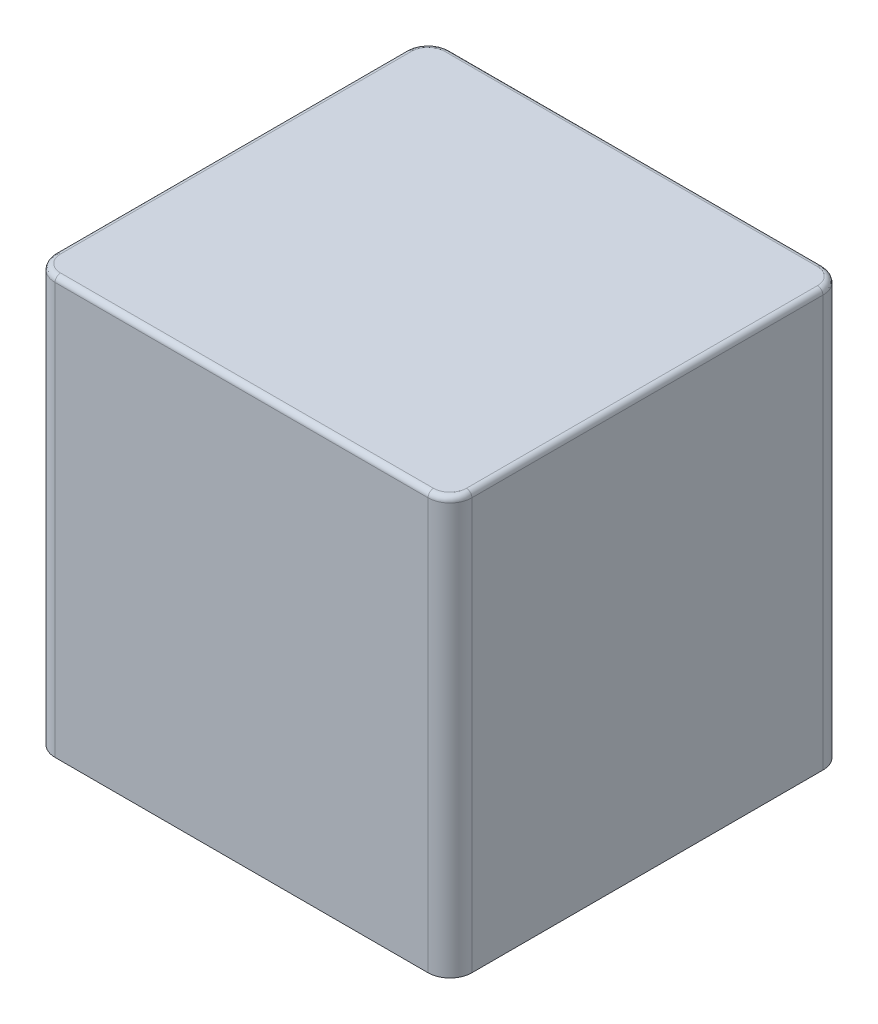
ISO-10303-21;
HEADER;
FILE_DESCRIPTION(('STEP AP214'),'2;1');
FILE_NAME('part.step','',(''),(''),'','','');
FILE_SCHEMA(('AUTOMOTIVE_DESIGN { 1 0 10303 214 1 1 1 1 }'));
ENDSEC;
DATA;
#1=APPLICATION_CONTEXT('core data for automotive mechanical design processes');
#2=APPLICATION_PROTOCOL_DEFINITION('international standard','automotive_design',2000,#1);
#3=PRODUCT_CONTEXT('',#1,'mechanical');
#4=PRODUCT('Part','Part','',(#3));
#5=PRODUCT_RELATED_PRODUCT_CATEGORY('part','',(#4));
#6=PRODUCT_DEFINITION_FORMATION('','',#4);
#7=PRODUCT_DEFINITION_CONTEXT('part definition',#1,'design');
#8=PRODUCT_DEFINITION('design','',#6,#7);
#9=PRODUCT_DEFINITION_SHAPE('','',#8);
#10=(LENGTH_UNIT() NAMED_UNIT(*) SI_UNIT(.MILLI.,.METRE.));
#11=(NAMED_UNIT(*) PLANE_ANGLE_UNIT() SI_UNIT($,.RADIAN.));
#12=(NAMED_UNIT(*) SI_UNIT($,.STERADIAN.) SOLID_ANGLE_UNIT());
#13=UNCERTAINTY_MEASURE_WITH_UNIT(LENGTH_MEASURE(1.E-05),#10,'distance_accuracy_value','');
#14=(GEOMETRIC_REPRESENTATION_CONTEXT(3) GLOBAL_UNCERTAINTY_ASSIGNED_CONTEXT((#13)) GLOBAL_UNIT_ASSIGNED_CONTEXT((#10,
#11,#12)) REPRESENTATION_CONTEXT('',''));
#15=CARTESIAN_POINT('',(0.,0.,0.));
#16=DIRECTION('',(0.,0.,1.));
#17=DIRECTION('',(1.,0.,0.));
#18=AXIS2_PLACEMENT_3D('',#15,#16,#17);
#19=CARTESIAN_POINT('',(0.,19.,0.));
#20=DIRECTION('',(0.,-1.,0.));
#21=DIRECTION('',(0.,0.,-1.));
#22=AXIS2_PLACEMENT_3D('',#19,#20,#21);
#23=PLANE('',#22);
#24=DIRECTION('',(0.,0.,-1.));
#25=VECTOR('',#24,1.);
#26=CARTESIAN_POINT('',(18.5,19.,0.));
#27=LINE('',#26,#25);
#28=CARTESIAN_POINT('',(18.5,19.,16.));
#29=VERTEX_POINT('',#28);
#30=CARTESIAN_POINT('',(18.5,19.,-16.));
#31=VERTEX_POINT('',#30);
#32=EDGE_CURVE('E209',#29,#31,#27,.T.);
#33=ORIENTED_EDGE('',*,*,#32,.T.);
#34=CARTESIAN_POINT('',(17.,19.,-16.));
#35=DIRECTION('',(0.,-1.,0.));
#36=DIRECTION('',(0.,0.,-1.));
#37=AXIS2_PLACEMENT_3D('',#34,#35,#36);
#38=CIRCLE('',#37,1.5);
#39=CARTESIAN_POINT('',(17.,19.,-17.5));
#40=VERTEX_POINT('',#39);
#41=EDGE_CURVE('E373',#31,#40,#38,.F.);
#42=ORIENTED_EDGE('',*,*,#41,.T.);
#43=DIRECTION('',(-1.,0.,0.));
#44=VECTOR('',#43,1.);
#45=CARTESIAN_POINT('',(0.,19.,-17.5));
#46=LINE('',#45,#44);
#47=CARTESIAN_POINT('',(-17.,19.,-17.5));
#48=VERTEX_POINT('',#47);
#49=EDGE_CURVE('E341',#40,#48,#46,.T.);
#50=ORIENTED_EDGE('',*,*,#49,.T.);
#51=CARTESIAN_POINT('',(-17.,19.,-16.));
#52=DIRECTION('',(0.,-1.,0.));
#53=DIRECTION('',(-1.,0.,0.));
#54=AXIS2_PLACEMENT_3D('',#51,#52,#53);
#55=CIRCLE('',#54,1.5);
#56=CARTESIAN_POINT('',(-18.5,19.,-16.));
#57=VERTEX_POINT('',#56);
#58=EDGE_CURVE('E313',#48,#57,#55,.F.);
#59=ORIENTED_EDGE('',*,*,#58,.T.);
#60=DIRECTION('',(0.,0.,1.));
#61=VECTOR('',#60,1.);
#62=CARTESIAN_POINT('',(-18.5,19.,0.));
#63=LINE('',#62,#61);
#64=CARTESIAN_POINT('',(-18.5,19.,16.));
#65=VERTEX_POINT('',#64);
#66=EDGE_CURVE('E295',#57,#65,#63,.T.);
#67=ORIENTED_EDGE('',*,*,#66,.T.);
#68=CARTESIAN_POINT('',(-17.,19.,16.));
#69=DIRECTION('',(0.,-1.,0.));
#70=DIRECTION('',(0.,0.,1.));
#71=AXIS2_PLACEMENT_3D('',#68,#69,#70);
#72=CIRCLE('',#71,1.5);
#73=CARTESIAN_POINT('',(-17.,19.,17.5));
#74=VERTEX_POINT('',#73);
#75=EDGE_CURVE('E267',#65,#74,#72,.F.);
#76=ORIENTED_EDGE('',*,*,#75,.T.);
#77=DIRECTION('',(1.,0.,0.));
#78=VECTOR('',#77,1.);
#79=CARTESIAN_POINT('',(0.,19.,17.5));
#80=LINE('',#79,#78);
#81=CARTESIAN_POINT('',(17.,19.,17.5));
#82=VERTEX_POINT('',#81);
#83=EDGE_CURVE('E231',#74,#82,#80,.T.);
#84=ORIENTED_EDGE('',*,*,#83,.T.);
#85=CARTESIAN_POINT('',(17.,19.,16.));
#86=DIRECTION('',(0.,-1.,0.));
#87=DIRECTION('',(1.,0.,0.));
#88=AXIS2_PLACEMENT_3D('',#85,#86,#87);
#89=CIRCLE('',#88,1.5);
#90=EDGE_CURVE('E227',#82,#29,#89,.F.);
#91=ORIENTED_EDGE('',*,*,#90,.T.);
#92=EDGE_LOOP('',(#33,#42,#50,#59,#67,#76,#84,#91));
#93=FACE_BOUND('',#92,.T.);
#94=ADVANCED_FACE('F17',(#93),#23,.F.);
#95=CARTESIAN_POINT('',(0.,14.,0.));
#96=DIRECTION('',(0.,-1.,0.));
#97=DIRECTION('',(0.,0.,-1.));
#98=AXIS2_PLACEMENT_3D('',#95,#96,#97);
#99=PLANE('',#98);
#100=DIRECTION('',(-1.,0.,0.));
#101=VECTOR('',#100,1.);
#102=CARTESIAN_POINT('',(0.,14.,15.));
#103=LINE('',#102,#101);
#104=CARTESIAN_POINT('',(15.,14.,15.));
#105=VERTEX_POINT('',#104);
#106=CARTESIAN_POINT('',(-15.,14.,15.));
#107=VERTEX_POINT('',#106);
#108=EDGE_CURVE('E148',#105,#107,#103,.T.);
#109=ORIENTED_EDGE('',*,*,#108,.T.);
#110=DIRECTION('',(0.,0.,-1.));
#111=VECTOR('',#110,1.);
#112=CARTESIAN_POINT('',(-15.,14.,0.));
#113=LINE('',#112,#111);
#114=CARTESIAN_POINT('',(-15.,14.,-15.));
#115=VERTEX_POINT('',#114);
#116=EDGE_CURVE('E166',#107,#115,#113,.T.);
#117=ORIENTED_EDGE('',*,*,#116,.T.);
#118=DIRECTION('',(1.,0.,0.));
#119=VECTOR('',#118,1.);
#120=CARTESIAN_POINT('',(0.,14.,-15.));
#121=LINE('',#120,#119);
#122=CARTESIAN_POINT('',(15.,14.,-15.));
#123=VERTEX_POINT('',#122);
#124=EDGE_CURVE('E160',#115,#123,#121,.T.);
#125=ORIENTED_EDGE('',*,*,#124,.T.);
#126=DIRECTION('',(0.,0.,1.));
#127=VECTOR('',#126,1.);
#128=CARTESIAN_POINT('',(15.,14.,0.));
#129=LINE('',#128,#127);
#130=EDGE_CURVE('E154',#123,#105,#129,.T.);
#131=ORIENTED_EDGE('',*,*,#130,.T.);
#132=EDGE_LOOP('',(#109,#117,#125,#131));
#133=FACE_BOUND('',#132,.T.);
#134=ADVANCED_FACE('F542',(#133),#99,.T.);
#135=CARTESIAN_POINT('',(-17.,18.5,-17.5));
#136=DIRECTION('',(1.,0.,0.));
#137=DIRECTION('',(0.,0.,-1.));
#138=AXIS2_PLACEMENT_3D('',#135,#136,#137);
#139=CYLINDRICAL_SURFACE('',#138,0.5);
#140=ORIENTED_EDGE('',*,*,#49,.F.);
#141=CARTESIAN_POINT('',(17.,18.5,-17.5));
#142=DIRECTION('',(-1.,0.,0.));
#143=DIRECTION('',(0.,0.,1.));
#144=AXIS2_PLACEMENT_3D('',#141,#142,#143);
#145=CIRCLE('',#144,0.5);
#146=CARTESIAN_POINT('',(17.,18.5,-18.));
#147=VERTEX_POINT('',#146);
#148=EDGE_CURVE('E169',#40,#147,#145,.T.);
#149=ORIENTED_EDGE('',*,*,#148,.T.);
#150=DIRECTION('',(1.,0.,0.));
#151=VECTOR('',#150,1.);
#152=CARTESIAN_POINT('',(0.,18.5,-18.));
#153=LINE('',#152,#151);
#154=CARTESIAN_POINT('',(-17.,18.5,-18.));
#155=VERTEX_POINT('',#154);
#156=EDGE_CURVE('E147',#147,#155,#153,.F.);
#157=ORIENTED_EDGE('',*,*,#156,.T.);
#158=CARTESIAN_POINT('',(-17.,18.5,-17.5));
#159=DIRECTION('',(1.,0.,0.));
#160=DIRECTION('',(0.,0.,-1.));
#161=AXIS2_PLACEMENT_3D('',#158,#159,#160);
#162=CIRCLE('',#161,0.5);
#163=EDGE_CURVE('E335',#155,#48,#162,.T.);
#164=ORIENTED_EDGE('',*,*,#163,.T.);
#165=EDGE_LOOP('',(#140,#149,#157,#164));
#166=FACE_BOUND('',#165,.T.);
#167=ADVANCED_FACE('F327',(#166),#139,.T.);
#168=CARTESIAN_POINT('',(-18.5,19.,-16.));
#169=CARTESIAN_POINT('',(-18.7928932188134,19.,-16.));
#170=CARTESIAN_POINT('',(-19.,18.7928932188134,-16.));
#171=CARTESIAN_POINT('',(-19.,18.5,-16.));
#172=(BOUNDED_CURVE() B_SPLINE_CURVE(3,(#168,#169,#170,#171),.UNSPECIFIED.,.F.,
.F.) B_SPLINE_CURVE_WITH_KNOTS((4,4),(0.,1.),
.UNSPECIFIED.) CURVE() GEOMETRIC_REPRESENTATION_ITEM() RATIONAL_B_SPLINE_CURVE((1.,
0.804737854124365,0.804737854124365,1.)) REPRESENTATION_ITEM(''));
#173=CARTESIAN_POINT('',(-17.,18.5,-16.));
#174=DIRECTION('',(0.,-1.,0.));
#175=AXIS1_PLACEMENT('',#173,#174);
#176=SURFACE_OF_REVOLUTION('',#172,#175);
#177=ORIENTED_EDGE('',*,*,#58,.F.);
#178=ORIENTED_EDGE('',*,*,#163,.F.);
#179=CARTESIAN_POINT('',(-17.,18.5,-16.));
#180=DIRECTION('',(0.,-1.,0.));
#181=DIRECTION('',(-1.,0.,0.));
#182=AXIS2_PLACEMENT_3D('',#179,#180,#181);
#183=CIRCLE('',#182,2.);
#184=CARTESIAN_POINT('',(-19.,18.5,-16.));
#185=VERTEX_POINT('',#184);
#186=EDGE_CURVE('E141',#155,#185,#183,.F.);
#187=ORIENTED_EDGE('',*,*,#186,.T.);
#188=CARTESIAN_POINT('',(-18.5,18.5,-16.));
#189=DIRECTION('',(0.,0.,1.));
#190=DIRECTION('',(0.,1.,0.));
#191=AXIS2_PLACEMENT_3D('',#188,#189,#190);
#192=CIRCLE('',#191,0.5);
#193=EDGE_CURVE('E303',#185,#57,#192,.F.);
#194=ORIENTED_EDGE('',*,*,#193,.T.);
#195=EDGE_LOOP('',(#177,#178,#187,#194));
#196=FACE_BOUND('',#195,.T.);
#197=ADVANCED_FACE('F317',(#196),#176,.T.);
#198=CARTESIAN_POINT('',(-18.5,18.5,-16.));
#199=DIRECTION('',(0.,0.,1.));
#200=DIRECTION('',(1.,0.,0.));
#201=AXIS2_PLACEMENT_3D('',#198,#199,#200);
#202=CYLINDRICAL_SURFACE('',#201,0.5);
#203=ORIENTED_EDGE('',*,*,#66,.F.);
#204=ORIENTED_EDGE('',*,*,#193,.F.);
#205=DIRECTION('',(0.,0.,1.));
#206=VECTOR('',#205,1.);
#207=CARTESIAN_POINT('',(-19.,18.5,0.));
#208=LINE('',#207,#206);
#209=CARTESIAN_POINT('',(-19.,18.5,16.));
#210=VERTEX_POINT('',#209);
#211=EDGE_CURVE('E82',#185,#210,#208,.T.);
#212=ORIENTED_EDGE('',*,*,#211,.T.);
#213=CARTESIAN_POINT('',(-18.5,18.5,16.));
#214=DIRECTION('',(0.,0.,-1.));
#215=DIRECTION('',(0.,1.,0.));
#216=AXIS2_PLACEMENT_3D('',#213,#214,#215);
#217=CIRCLE('',#216,0.5);
#218=EDGE_CURVE('E277',#210,#65,#217,.T.);
#219=ORIENTED_EDGE('',*,*,#218,.T.);
#220=EDGE_LOOP('',(#203,#204,#212,#219));
#221=FACE_BOUND('',#220,.T.);
#222=ADVANCED_FACE('F286',(#221),#202,.T.);
#223=CARTESIAN_POINT('',(-17.,19.,17.5));
#224=CARTESIAN_POINT('',(-17.,19.,17.7928932188135));
#225=CARTESIAN_POINT('',(-17.,18.7928932188134,18.));
#226=CARTESIAN_POINT('',(-17.,18.5,18.));
#227=(BOUNDED_CURVE() B_SPLINE_CURVE(3,(#223,#224,#225,#226),.UNSPECIFIED.,.F.,
.F.) B_SPLINE_CURVE_WITH_KNOTS((4,4),(0.,1.),
.UNSPECIFIED.) CURVE() GEOMETRIC_REPRESENTATION_ITEM() RATIONAL_B_SPLINE_CURVE((1.,
0.804737854124365,0.804737854124365,1.)) REPRESENTATION_ITEM(''));
#228=CARTESIAN_POINT('',(-17.,18.5,16.));
#229=DIRECTION('',(0.,-1.,0.));
#230=AXIS1_PLACEMENT('',#228,#229);
#231=SURFACE_OF_REVOLUTION('',#227,#230);
#232=ORIENTED_EDGE('',*,*,#75,.F.);
#233=ORIENTED_EDGE('',*,*,#218,.F.);
#234=CARTESIAN_POINT('',(-17.,18.5,16.));
#235=DIRECTION('',(0.,-1.,0.));
#236=DIRECTION('',(0.,0.,1.));
#237=AXIS2_PLACEMENT_3D('',#234,#235,#236);
#238=CIRCLE('',#237,2.);
#239=CARTESIAN_POINT('',(-17.,18.5,18.));
#240=VERTEX_POINT('',#239);
#241=EDGE_CURVE('E83',#210,#240,#238,.F.);
#242=ORIENTED_EDGE('',*,*,#241,.T.);
#243=CARTESIAN_POINT('',(-17.,18.5,17.5));
#244=DIRECTION('',(1.,0.,0.));
#245=DIRECTION('',(0.,1.,0.));
#246=AXIS2_PLACEMENT_3D('',#243,#244,#245);
#247=CIRCLE('',#246,0.5);
#248=EDGE_CURVE('E264',#240,#74,#247,.F.);
#249=ORIENTED_EDGE('',*,*,#248,.T.);
#250=EDGE_LOOP('',(#232,#233,#242,#249));
#251=FACE_BOUND('',#250,.T.);
#252=ADVANCED_FACE('F282',(#251),#231,.T.);
#253=CARTESIAN_POINT('',(-17.,18.5,17.5));
#254=DIRECTION('',(1.,0.,0.));
#255=DIRECTION('',(0.,0.,-1.));
#256=AXIS2_PLACEMENT_3D('',#253,#254,#255);
#257=CYLINDRICAL_SURFACE('',#256,0.5);
#258=ORIENTED_EDGE('',*,*,#83,.F.);
#259=ORIENTED_EDGE('',*,*,#248,.F.);
#260=DIRECTION('',(1.,0.,0.));
#261=VECTOR('',#260,1.);
#262=CARTESIAN_POINT('',(0.,18.5,18.));
#263=LINE('',#262,#261);
#264=CARTESIAN_POINT('',(17.,18.5,18.));
#265=VERTEX_POINT('',#264);
#266=EDGE_CURVE('E131',#240,#265,#263,.T.);
#267=ORIENTED_EDGE('',*,*,#266,.T.);
#268=CARTESIAN_POINT('',(17.,18.5,17.5));
#269=DIRECTION('',(-1.,0.,0.));
#270=DIRECTION('',(0.,0.,1.));
#271=AXIS2_PLACEMENT_3D('',#268,#269,#270);
#272=CIRCLE('',#271,0.5);
#273=EDGE_CURVE('E252',#265,#82,#272,.T.);
#274=ORIENTED_EDGE('',*,*,#273,.T.);
#275=EDGE_LOOP('',(#258,#259,#267,#274));
#276=FACE_BOUND('',#275,.T.);
#277=ADVANCED_FACE('F243',(#276),#257,.T.);
#278=CARTESIAN_POINT('',(18.5,19.,16.));
#279=CARTESIAN_POINT('',(18.7928932188134,19.,16.));
#280=CARTESIAN_POINT('',(19.,18.7928932188134,16.));
#281=CARTESIAN_POINT('',(19.,18.5,16.));
#282=(BOUNDED_CURVE() B_SPLINE_CURVE(3,(#278,#279,#280,#281),.UNSPECIFIED.,.F.,
.F.) B_SPLINE_CURVE_WITH_KNOTS((4,4),(0.,1.),
.UNSPECIFIED.) CURVE() GEOMETRIC_REPRESENTATION_ITEM() RATIONAL_B_SPLINE_CURVE((1.,
0.804737854124365,0.804737854124365,1.)) REPRESENTATION_ITEM(''));
#283=CARTESIAN_POINT('',(17.,18.5,16.));
#284=DIRECTION('',(0.,-1.,0.));
#285=AXIS1_PLACEMENT('',#283,#284);
#286=SURFACE_OF_REVOLUTION('',#282,#285);
#287=ORIENTED_EDGE('',*,*,#90,.F.);
#288=ORIENTED_EDGE('',*,*,#273,.F.);
#289=CARTESIAN_POINT('',(17.,18.5,16.));
#290=DIRECTION('',(0.,1.,0.));
#291=DIRECTION('',(0.,0.,1.));
#292=AXIS2_PLACEMENT_3D('',#289,#290,#291);
#293=CIRCLE('',#292,2.);
#294=CARTESIAN_POINT('',(19.,18.5,16.));
#295=VERTEX_POINT('',#294);
#296=EDGE_CURVE('E125',#265,#295,#293,.T.);
#297=ORIENTED_EDGE('',*,*,#296,.T.);
#298=CARTESIAN_POINT('',(18.5,18.5,16.));
#299=DIRECTION('',(0.,0.,1.));
#300=DIRECTION('',(1.,0.,0.));
#301=AXIS2_PLACEMENT_3D('',#298,#299,#300);
#302=CIRCLE('',#301,0.5);
#303=EDGE_CURVE('E217',#295,#29,#302,.T.);
#304=ORIENTED_EDGE('',*,*,#303,.T.);
#305=EDGE_LOOP('',(#287,#288,#297,#304));
#306=FACE_BOUND('',#305,.T.);
#307=ADVANCED_FACE('F233',(#306),#286,.T.);
#308=CARTESIAN_POINT('',(18.5,18.5,-16.));
#309=DIRECTION('',(0.,0.,1.));
#310=DIRECTION('',(1.,0.,0.));
#311=AXIS2_PLACEMENT_3D('',#308,#309,#310);
#312=CYLINDRICAL_SURFACE('',#311,0.5);
#313=ORIENTED_EDGE('',*,*,#32,.F.);
#314=ORIENTED_EDGE('',*,*,#303,.F.);
#315=DIRECTION('',(0.,0.,-1.));
#316=VECTOR('',#315,1.);
#317=CARTESIAN_POINT('',(19.,18.5,0.));
#318=LINE('',#317,#316);
#319=CARTESIAN_POINT('',(19.,18.5,-16.));
#320=VERTEX_POINT('',#319);
#321=EDGE_CURVE('E119',#295,#320,#318,.T.);
#322=ORIENTED_EDGE('',*,*,#321,.T.);
#323=CARTESIAN_POINT('',(18.5,18.5,-16.));
#324=DIRECTION('',(0.,0.,1.));
#325=DIRECTION('',(0.,-1.,0.));
#326=AXIS2_PLACEMENT_3D('',#323,#324,#325);
#327=CIRCLE('',#326,0.5);
#328=EDGE_CURVE('E186',#320,#31,#327,.T.);
#329=ORIENTED_EDGE('',*,*,#328,.T.);
#330=EDGE_LOOP('',(#313,#314,#322,#329));
#331=FACE_BOUND('',#330,.T.);
#332=ADVANCED_FACE('F198',(#331),#312,.T.);
#333=CARTESIAN_POINT('',(17.,19.,-17.5));
#334=CARTESIAN_POINT('',(17.,19.,-17.7928932188135));
#335=CARTESIAN_POINT('',(17.,18.7928932188134,-18.));
#336=CARTESIAN_POINT('',(17.,18.5,-18.));
#337=(BOUNDED_CURVE() B_SPLINE_CURVE(3,(#333,#334,#335,#336),.UNSPECIFIED.,.F.,
.F.) B_SPLINE_CURVE_WITH_KNOTS((4,4),(0.,1.),
.UNSPECIFIED.) CURVE() GEOMETRIC_REPRESENTATION_ITEM() RATIONAL_B_SPLINE_CURVE((1.,
0.804737854124365,0.804737854124365,1.)) REPRESENTATION_ITEM(''));
#338=CARTESIAN_POINT('',(17.,18.5,-16.));
#339=DIRECTION('',(0.,-1.,0.));
#340=AXIS1_PLACEMENT('',#338,#339);
#341=SURFACE_OF_REVOLUTION('',#337,#340);
#342=ORIENTED_EDGE('',*,*,#41,.F.);
#343=ORIENTED_EDGE('',*,*,#328,.F.);
#344=CARTESIAN_POINT('',(17.,18.5,-16.));
#345=DIRECTION('',(0.,1.,0.));
#346=DIRECTION('',(1.,0.,0.));
#347=AXIS2_PLACEMENT_3D('',#344,#345,#346);
#348=CIRCLE('',#347,2.);
#349=EDGE_CURVE('E110',#320,#147,#348,.T.);
#350=ORIENTED_EDGE('',*,*,#349,.T.);
#351=ORIENTED_EDGE('',*,*,#148,.F.);
#352=EDGE_LOOP('',(#342,#343,#350,#351));
#353=FACE_BOUND('',#352,.T.);
#354=ADVANCED_FACE('F192',(#353),#341,.T.);
#355=CARTESIAN_POINT('',(-15.,0.,0.));
#356=DIRECTION('',(1.,0.,0.));
#357=DIRECTION('',(0.,0.,-1.));
#358=AXIS2_PLACEMENT_3D('',#355,#356,#357);
#359=PLANE('',#358);
#360=DIRECTION('',(0.,0.,-1.));
#361=VECTOR('',#360,1.);
#362=CARTESIAN_POINT('',(-15.,-14.,0.));
#363=LINE('',#362,#361);
#364=CARTESIAN_POINT('',(-15.,-14.,15.));
#365=VERTEX_POINT('',#364);
#366=CARTESIAN_POINT('',(-15.,-14.,-15.));
#367=VERTEX_POINT('',#366);
#368=EDGE_CURVE('E104',#365,#367,#363,.T.);
#369=ORIENTED_EDGE('',*,*,#368,.T.);
#370=DIRECTION('',(0.,1.,0.));
#371=VECTOR('',#370,1.);
#372=CARTESIAN_POINT('',(-15.,0.,-15.));
#373=LINE('',#372,#371);
#374=EDGE_CURVE('E163',#367,#115,#373,.T.);
#375=ORIENTED_EDGE('',*,*,#374,.T.);
#376=ORIENTED_EDGE('',*,*,#116,.F.);
#377=DIRECTION('',(0.,1.,0.));
#378=VECTOR('',#377,1.);
#379=CARTESIAN_POINT('',(-15.,0.,15.));
#380=LINE('',#379,#378);
#381=EDGE_CURVE('E144',#107,#365,#380,.F.);
#382=ORIENTED_EDGE('',*,*,#381,.T.);
#383=EDGE_LOOP('',(#369,#375,#376,#382));
#384=FACE_BOUND('',#383,.T.);
#385=ADVANCED_FACE('F197',(#384),#359,.T.);
#386=CARTESIAN_POINT('',(0.,0.,-15.));
#387=DIRECTION('',(0.,0.,1.));
#388=DIRECTION('',(1.,0.,0.));
#389=AXIS2_PLACEMENT_3D('',#386,#387,#388);
#390=PLANE('',#389);
#391=DIRECTION('',(0.,1.,0.));
#392=VECTOR('',#391,1.);
#393=CARTESIAN_POINT('',(15.,0.,-15.));
#394=LINE('',#393,#392);
#395=CARTESIAN_POINT('',(15.,-14.,-15.));
#396=VERTEX_POINT('',#395);
#397=EDGE_CURVE('E157',#396,#123,#394,.T.);
#398=ORIENTED_EDGE('',*,*,#397,.T.);
#399=ORIENTED_EDGE('',*,*,#124,.F.);
#400=ORIENTED_EDGE('',*,*,#374,.F.);
#401=DIRECTION('',(1.,0.,0.));
#402=VECTOR('',#401,1.);
#403=CARTESIAN_POINT('',(0.,-14.,-15.));
#404=LINE('',#403,#402);
#405=EDGE_CURVE('E101',#367,#396,#404,.T.);
#406=ORIENTED_EDGE('',*,*,#405,.T.);
#407=EDGE_LOOP('',(#398,#399,#400,#406));
#408=FACE_BOUND('',#407,.T.);
#409=ADVANCED_FACE('F525',(#408),#390,.T.);
#410=CARTESIAN_POINT('',(15.,0.,0.));
#411=DIRECTION('',(-1.,0.,0.));
#412=DIRECTION('',(0.,0.,1.));
#413=AXIS2_PLACEMENT_3D('',#410,#411,#412);
#414=PLANE('',#413);
#415=DIRECTION('',(0.,1.,0.));
#416=VECTOR('',#415,1.);
#417=CARTESIAN_POINT('',(15.,0.,15.));
#418=LINE('',#417,#416);
#419=CARTESIAN_POINT('',(15.,-14.,15.));
#420=VERTEX_POINT('',#419);
#421=EDGE_CURVE('E151',#420,#105,#418,.T.);
#422=ORIENTED_EDGE('',*,*,#421,.T.);
#423=ORIENTED_EDGE('',*,*,#130,.F.);
#424=ORIENTED_EDGE('',*,*,#397,.F.);
#425=DIRECTION('',(0.,0.,-1.));
#426=VECTOR('',#425,1.);
#427=CARTESIAN_POINT('',(15.,-14.,0.));
#428=LINE('',#427,#426);
#429=EDGE_CURVE('E98',#396,#420,#428,.F.);
#430=ORIENTED_EDGE('',*,*,#429,.T.);
#431=EDGE_LOOP('',(#422,#423,#424,#430));
#432=FACE_BOUND('',#431,.T.);
#433=ADVANCED_FACE('F522',(#432),#414,.T.);
#434=CARTESIAN_POINT('',(0.,0.,15.));
#435=DIRECTION('',(0.,0.,-1.));
#436=DIRECTION('',(-1.,0.,0.));
#437=AXIS2_PLACEMENT_3D('',#434,#435,#436);
#438=PLANE('',#437);
#439=ORIENTED_EDGE('',*,*,#381,.F.);
#440=ORIENTED_EDGE('',*,*,#108,.F.);
#441=ORIENTED_EDGE('',*,*,#421,.F.);
#442=DIRECTION('',(1.,0.,0.));
#443=VECTOR('',#442,1.);
#444=CARTESIAN_POINT('',(0.,-14.,15.));
#445=LINE('',#444,#443);
#446=EDGE_CURVE('E95',#420,#365,#445,.F.);
#447=ORIENTED_EDGE('',*,*,#446,.T.);
#448=EDGE_LOOP('',(#439,#440,#441,#447));
#449=FACE_BOUND('',#448,.T.);
#450=ADVANCED_FACE('F519',(#449),#438,.T.);
#451=CARTESIAN_POINT('',(0.,0.,-18.));
#452=DIRECTION('',(0.,0.,1.));
#453=DIRECTION('',(1.,0.,0.));
#454=AXIS2_PLACEMENT_3D('',#451,#452,#453);
#455=PLANE('',#454);
#456=DIRECTION('',(0.,-1.,0.));
#457=VECTOR('',#456,1.);
#458=CARTESIAN_POINT('',(17.,-0.25,-18.));
#459=LINE('',#458,#457);
#460=CARTESIAN_POINT('',(17.,-19.,-18.));
#461=VERTEX_POINT('',#460);
#462=EDGE_CURVE('E108',#147,#461,#459,.T.);
#463=ORIENTED_EDGE('',*,*,#462,.T.);
#464=DIRECTION('',(1.,0.,0.));
#465=VECTOR('',#464,1.);
#466=CARTESIAN_POINT('',(0.,-19.,-18.));
#467=LINE('',#466,#465);
#468=CARTESIAN_POINT('',(-17.,-19.,-18.));
#469=VERTEX_POINT('',#468);
#470=EDGE_CURVE('E61',#461,#469,#467,.F.);
#471=ORIENTED_EDGE('',*,*,#470,.T.);
#472=DIRECTION('',(0.,1.,0.));
#473=VECTOR('',#472,1.);
#474=CARTESIAN_POINT('',(-17.,-0.25,-18.));
#475=LINE('',#474,#473);
#476=EDGE_CURVE('E73',#469,#155,#475,.T.);
#477=ORIENTED_EDGE('',*,*,#476,.T.);
#478=ORIENTED_EDGE('',*,*,#156,.F.);
#479=EDGE_LOOP('',(#463,#471,#477,#478));
#480=FACE_BOUND('',#479,.T.);
#481=ADVANCED_FACE('F446',(#480),#455,.F.);
#482=CARTESIAN_POINT('',(-17.,18.5,-16.));
#483=DIRECTION('',(0.,-1.,0.));
#484=DIRECTION('',(0.,0.,-1.));
#485=AXIS2_PLACEMENT_3D('',#482,#483,#484);
#486=CYLINDRICAL_SURFACE('',#485,2.);
#487=CARTESIAN_POINT('',(-17.,-19.,-16.));
#488=DIRECTION('',(0.,-1.,0.));
#489=DIRECTION('',(0.,0.,-1.));
#490=AXIS2_PLACEMENT_3D('',#487,#488,#489);
#491=CIRCLE('',#490,2.);
#492=CARTESIAN_POINT('',(-19.,-19.,-16.));
#493=VERTEX_POINT('',#492);
#494=EDGE_CURVE('E21',#469,#493,#491,.F.);
#495=ORIENTED_EDGE('',*,*,#494,.T.);
#496=DIRECTION('',(0.,1.,0.));
#497=VECTOR('',#496,1.);
#498=CARTESIAN_POINT('',(-19.,0.,-16.));
#499=LINE('',#498,#497);
#500=EDGE_CURVE('E71',#493,#185,#499,.T.);
#501=ORIENTED_EDGE('',*,*,#500,.T.);
#502=ORIENTED_EDGE('',*,*,#186,.F.);
#503=ORIENTED_EDGE('',*,*,#476,.F.);
#504=EDGE_LOOP('',(#495,#501,#502,#503));
#505=FACE_BOUND('',#504,.T.);
#506=ADVANCED_FACE('F68',(#505),#486,.T.);
#507=CARTESIAN_POINT('',(-19.,0.,0.));
#508=DIRECTION('',(-1.,0.,0.));
#509=DIRECTION('',(0.,0.,1.));
#510=AXIS2_PLACEMENT_3D('',#507,#508,#509);
#511=PLANE('',#510);
#512=DIRECTION('',(0.,0.,1.));
#513=VECTOR('',#512,1.);
#514=CARTESIAN_POINT('',(-19.,-19.,0.));
#515=LINE('',#514,#513);
#516=CARTESIAN_POINT('',(-19.,-19.,16.));
#517=VERTEX_POINT('',#516);
#518=EDGE_CURVE('E76',#493,#517,#515,.T.);
#519=ORIENTED_EDGE('',*,*,#518,.T.);
#520=DIRECTION('',(0.,1.,0.));
#521=VECTOR('',#520,1.);
#522=CARTESIAN_POINT('',(-19.,-0.25,16.));
#523=LINE('',#522,#521);
#524=EDGE_CURVE('E134',#517,#210,#523,.T.);
#525=ORIENTED_EDGE('',*,*,#524,.T.);
#526=ORIENTED_EDGE('',*,*,#211,.F.);
#527=ORIENTED_EDGE('',*,*,#500,.F.);
#528=EDGE_LOOP('',(#519,#525,#526,#527));
#529=FACE_BOUND('',#528,.T.);
#530=ADVANCED_FACE('F78',(#529),#511,.T.);
#531=CARTESIAN_POINT('',(-17.,18.5,16.));
#532=DIRECTION('',(0.,-1.,0.));
#533=DIRECTION('',(1.,0.,0.));
#534=AXIS2_PLACEMENT_3D('',#531,#532,#533);
#535=CYLINDRICAL_SURFACE('',#534,2.);
#536=CARTESIAN_POINT('',(-17.,-19.,16.));
#537=DIRECTION('',(0.,-1.,0.));
#538=DIRECTION('',(1.,0.,0.));
#539=AXIS2_PLACEMENT_3D('',#536,#537,#538);
#540=CIRCLE('',#539,2.);
#541=CARTESIAN_POINT('',(-17.,-19.,18.));
#542=VERTEX_POINT('',#541);
#543=EDGE_CURVE('E88',#517,#542,#540,.F.);
#544=ORIENTED_EDGE('',*,*,#543,.T.);
#545=DIRECTION('',(0.,1.,0.));
#546=VECTOR('',#545,1.);
#547=CARTESIAN_POINT('',(-17.,0.,18.));
#548=LINE('',#547,#546);
#549=EDGE_CURVE('E128',#542,#240,#548,.T.);
#550=ORIENTED_EDGE('',*,*,#549,.T.);
#551=ORIENTED_EDGE('',*,*,#241,.F.);
#552=ORIENTED_EDGE('',*,*,#524,.F.);
#553=EDGE_LOOP('',(#544,#550,#551,#552));
#554=FACE_BOUND('',#553,.T.);
#555=ADVANCED_FACE('F479',(#554),#535,.T.);
#556=CARTESIAN_POINT('',(0.,0.,18.));
#557=DIRECTION('',(0.,0.,1.));
#558=DIRECTION('',(1.,0.,0.));
#559=AXIS2_PLACEMENT_3D('',#556,#557,#558);
#560=PLANE('',#559);
#561=DIRECTION('',(1.,0.,0.));
#562=VECTOR('',#561,1.);
#563=CARTESIAN_POINT('',(0.,-19.,18.));
#564=LINE('',#563,#562);
#565=CARTESIAN_POINT('',(17.,-19.,18.));
#566=VERTEX_POINT('',#565);
#567=EDGE_CURVE('E90',#542,#566,#564,.T.);
#568=ORIENTED_EDGE('',*,*,#567,.T.);
#569=DIRECTION('',(0.,1.,0.));
#570=VECTOR('',#569,1.);
#571=CARTESIAN_POINT('',(17.,-0.25,18.));
#572=LINE('',#571,#570);
#573=EDGE_CURVE('E122',#566,#265,#572,.T.);
#574=ORIENTED_EDGE('',*,*,#573,.T.);
#575=ORIENTED_EDGE('',*,*,#266,.F.);
#576=ORIENTED_EDGE('',*,*,#549,.F.);
#577=EDGE_LOOP('',(#568,#574,#575,#576));
#578=FACE_BOUND('',#577,.T.);
#579=ADVANCED_FACE('F429',(#578),#560,.T.);
#580=CARTESIAN_POINT('',(17.,-19.,16.));
#581=DIRECTION('',(0.,1.,0.));
#582=DIRECTION('',(0.,0.,1.));
#583=AXIS2_PLACEMENT_3D('',#580,#581,#582);
#584=CYLINDRICAL_SURFACE('',#583,2.);
#585=CARTESIAN_POINT('',(17.,-19.,16.));
#586=DIRECTION('',(0.,1.,0.));
#587=DIRECTION('',(0.,0.,1.));
#588=AXIS2_PLACEMENT_3D('',#585,#586,#587);
#589=CIRCLE('',#588,2.);
#590=CARTESIAN_POINT('',(19.,-19.,16.));
#591=VERTEX_POINT('',#590);
#592=EDGE_CURVE('E433',#566,#591,#589,.T.);
#593=ORIENTED_EDGE('',*,*,#592,.T.);
#594=DIRECTION('',(0.,1.,0.));
#595=VECTOR('',#594,1.);
#596=CARTESIAN_POINT('',(19.,0.,16.));
#597=LINE('',#596,#595);
#598=EDGE_CURVE('E116',#591,#295,#597,.T.);
#599=ORIENTED_EDGE('',*,*,#598,.T.);
#600=ORIENTED_EDGE('',*,*,#296,.F.);
#601=ORIENTED_EDGE('',*,*,#573,.F.);
#602=EDGE_LOOP('',(#593,#599,#600,#601));
#603=FACE_BOUND('',#602,.T.);
#604=ADVANCED_FACE('F432',(#603),#584,.T.);
#605=CARTESIAN_POINT('',(19.,0.,0.));
#606=DIRECTION('',(1.,0.,0.));
#607=DIRECTION('',(0.,0.,-1.));
#608=AXIS2_PLACEMENT_3D('',#605,#606,#607);
#609=PLANE('',#608);
#610=DIRECTION('',(0.,0.,1.));
#611=VECTOR('',#610,1.);
#612=CARTESIAN_POINT('',(19.,-19.,0.));
#613=LINE('',#612,#611);
#614=CARTESIAN_POINT('',(19.,-19.,-16.));
#615=VERTEX_POINT('',#614);
#616=EDGE_CURVE('E36',#591,#615,#613,.F.);
#617=ORIENTED_EDGE('',*,*,#616,.T.);
#618=DIRECTION('',(0.,1.,0.));
#619=VECTOR('',#618,1.);
#620=CARTESIAN_POINT('',(19.,-0.25,-16.));
#621=LINE('',#620,#619);
#622=EDGE_CURVE('E107',#615,#320,#621,.T.);
#623=ORIENTED_EDGE('',*,*,#622,.T.);
#624=ORIENTED_EDGE('',*,*,#321,.F.);
#625=ORIENTED_EDGE('',*,*,#598,.F.);
#626=EDGE_LOOP('',(#617,#623,#624,#625));
#627=FACE_BOUND('',#626,.T.);
#628=ADVANCED_FACE('F435',(#627),#609,.T.);
#629=CARTESIAN_POINT('',(17.,-19.,-16.));
#630=DIRECTION('',(0.,1.,0.));
#631=DIRECTION('',(0.,0.,1.));
#632=AXIS2_PLACEMENT_3D('',#629,#630,#631);
#633=CYLINDRICAL_SURFACE('',#632,2.);
#634=CARTESIAN_POINT('',(17.,-19.,-16.));
#635=DIRECTION('',(0.,1.,0.));
#636=DIRECTION('',(0.,0.,1.));
#637=AXIS2_PLACEMENT_3D('',#634,#635,#636);
#638=CIRCLE('',#637,2.);
#639=EDGE_CURVE('E481',#615,#461,#638,.T.);
#640=ORIENTED_EDGE('',*,*,#639,.T.);
#641=ORIENTED_EDGE('',*,*,#462,.F.);
#642=ORIENTED_EDGE('',*,*,#349,.F.);
#643=ORIENTED_EDGE('',*,*,#622,.F.);
#644=EDGE_LOOP('',(#640,#641,#642,#643));
#645=FACE_BOUND('',#644,.T.);
#646=ADVANCED_FACE('F442',(#645),#633,.T.);
#647=CARTESIAN_POINT('',(0.,-14.,0.));
#648=DIRECTION('',(0.,-1.,0.));
#649=DIRECTION('',(0.,0.,-1.));
#650=AXIS2_PLACEMENT_3D('',#647,#648,#649);
#651=PLANE('',#650);
#652=CARTESIAN_POINT('',(0.,-14.,0.));
#653=DIRECTION('',(0.,-1.,0.));
#654=DIRECTION('',(0.,0.,-1.));
#655=AXIS2_PLACEMENT_3D('',#652,#653,#654);
#656=CIRCLE('',#655,14.);
#657=CARTESIAN_POINT('',(0.,-14.,-14.));
#658=VERTEX_POINT('',#657);
#659=EDGE_CURVE('E27',#658,#658,#656,.T.);
#660=ORIENTED_EDGE('',*,*,#659,.T.);
#661=EDGE_LOOP('',(#660));
#662=FACE_BOUND('',#661,.T.);
#663=ORIENTED_EDGE('',*,*,#429,.F.);
#664=ORIENTED_EDGE('',*,*,#405,.F.);
#665=ORIENTED_EDGE('',*,*,#368,.F.);
#666=ORIENTED_EDGE('',*,*,#446,.F.);
#667=EDGE_LOOP('',(#663,#664,#665,#666));
#668=FACE_BOUND('',#667,.T.);
#669=ADVANCED_FACE('F486',(#662,#668),#651,.F.);
#670=CARTESIAN_POINT('',(0.,-19.,0.));
#671=DIRECTION('',(0.,1.,0.));
#672=DIRECTION('',(0.,0.,1.));
#673=AXIS2_PLACEMENT_3D('',#670,#671,#672);
#674=PLANE('',#673);
#675=CARTESIAN_POINT('',(0.,-19.,0.));
#676=DIRECTION('',(0.,-1.,0.));
#677=DIRECTION('',(0.,0.,-1.));
#678=AXIS2_PLACEMENT_3D('',#675,#676,#677);
#679=CIRCLE('',#678,14.);
#680=CARTESIAN_POINT('',(0.,-19.,-14.));
#681=VERTEX_POINT('',#680);
#682=EDGE_CURVE('E11',#681,#681,#679,.F.);
#683=ORIENTED_EDGE('',*,*,#682,.T.);
#684=EDGE_LOOP('',(#683));
#685=FACE_BOUND('',#684,.T.);
#686=ORIENTED_EDGE('',*,*,#616,.F.);
#687=ORIENTED_EDGE('',*,*,#592,.F.);
#688=ORIENTED_EDGE('',*,*,#567,.F.);
#689=ORIENTED_EDGE('',*,*,#543,.F.);
#690=ORIENTED_EDGE('',*,*,#518,.F.);
#691=ORIENTED_EDGE('',*,*,#494,.F.);
#692=ORIENTED_EDGE('',*,*,#470,.F.);
#693=ORIENTED_EDGE('',*,*,#639,.F.);
#694=EDGE_LOOP('',(#686,#687,#688,#689,#690,#691,#692,#693));
#695=FACE_BOUND('',#694,.T.);
#696=ADVANCED_FACE('F86',(#685,#695),#674,.F.);
#697=CARTESIAN_POINT('',(0.,-14.,0.));
#698=DIRECTION('',(0.,-1.,0.));
#699=DIRECTION('',(0.,0.,-1.));
#700=AXIS2_PLACEMENT_3D('',#697,#698,#699);
#701=CYLINDRICAL_SURFACE('',#700,14.);
#702=ORIENTED_EDGE('',*,*,#682,.F.);
#703=EDGE_LOOP('',(#702));
#704=FACE_BOUND('',#703,.T.);
#705=ORIENTED_EDGE('',*,*,#659,.F.);
#706=EDGE_LOOP('',(#705));
#707=FACE_BOUND('',#706,.T.);
#708=ADVANCED_FACE('F489',(#704,#707),#701,.F.);
#709=CLOSED_SHELL('',(#94,#134,#167,#197,#222,#252,#277,#307,#332,#354,#385,#409,#433,#450,#481,
#506,#530,#555,#579,#604,#628,#646,#669,#696,#708));
#710=MANIFOLD_SOLID_BREP('B1',#709);
#711=ADVANCED_BREP_SHAPE_REPRESENTATION('',(#18,#710),#14);
#712=SHAPE_DEFINITION_REPRESENTATION(#9,#711);
ENDSEC;
END-ISO-10303-21;
